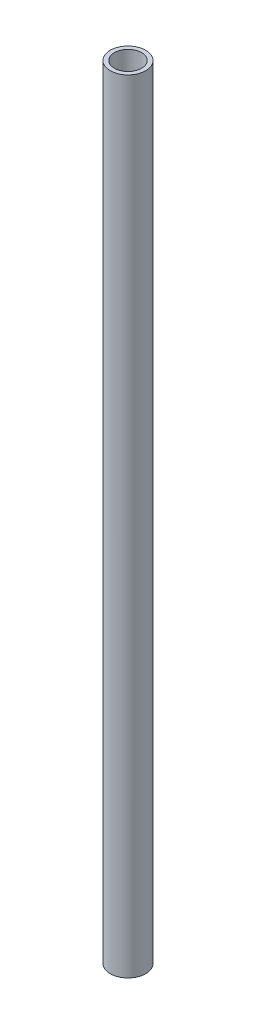
ISO-10303-21;
HEADER;
FILE_DESCRIPTION(('STEP AP214'),'2;1');
FILE_NAME('part.step','',(''),(''),'','','');
FILE_SCHEMA(('AUTOMOTIVE_DESIGN { 1 0 10303 214 1 1 1 1 }'));
ENDSEC;
DATA;
#1=APPLICATION_CONTEXT('core data for automotive mechanical design processes');
#2=APPLICATION_PROTOCOL_DEFINITION('international standard','automotive_design',2000,#1);
#3=PRODUCT_CONTEXT('',#1,'mechanical');
#4=PRODUCT('Part','Part','',(#3));
#5=PRODUCT_RELATED_PRODUCT_CATEGORY('part','',(#4));
#6=PRODUCT_DEFINITION_FORMATION('','',#4);
#7=PRODUCT_DEFINITION_CONTEXT('part definition',#1,'design');
#8=PRODUCT_DEFINITION('design','',#6,#7);
#9=PRODUCT_DEFINITION_SHAPE('','',#8);
#10=(LENGTH_UNIT() NAMED_UNIT(*) SI_UNIT(.MILLI.,.METRE.));
#11=(NAMED_UNIT(*) PLANE_ANGLE_UNIT() SI_UNIT($,.RADIAN.));
#12=(NAMED_UNIT(*) SI_UNIT($,.STERADIAN.) SOLID_ANGLE_UNIT());
#13=UNCERTAINTY_MEASURE_WITH_UNIT(LENGTH_MEASURE(1.E-05),#10,'distance_accuracy_value','');
#14=(GEOMETRIC_REPRESENTATION_CONTEXT(3) GLOBAL_UNCERTAINTY_ASSIGNED_CONTEXT((#13)) GLOBAL_UNIT_ASSIGNED_CONTEXT((#10,
#11,#12)) REPRESENTATION_CONTEXT('',''));
#15=CARTESIAN_POINT('',(0.,0.,0.));
#16=DIRECTION('',(0.,0.,1.));
#17=DIRECTION('',(1.,0.,0.));
#18=AXIS2_PLACEMENT_3D('',#15,#16,#17);
#19=CARTESIAN_POINT('',(0.,-140.085760537601,0.));
#20=DIRECTION('',(0.,1.,0.));
#21=DIRECTION('',(-1.,0.,0.));
#22=AXIS2_PLACEMENT_3D('',#19,#20,#21);
#23=PLANE('',#22);
#24=CARTESIAN_POINT('',(0.,-140.085760537601,0.));
#25=DIRECTION('',(0.,1.,0.));
#26=DIRECTION('',(-1.,0.,0.));
#27=AXIS2_PLACEMENT_3D('',#24,#25,#26);
#28=CIRCLE('',#27,6.35);
#29=CARTESIAN_POINT('',(-6.35,-140.085760537601,0.));
#30=VERTEX_POINT('',#29);
#31=EDGE_CURVE('E34',#30,#30,#28,.T.);
#32=ORIENTED_EDGE('',*,*,#31,.F.);
#33=EDGE_LOOP('',(#32));
#34=FACE_BOUND('',#33,.T.);
#35=CARTESIAN_POINT('',(0.,-140.085760537601,0.));
#36=DIRECTION('',(0.,1.,0.));
#37=DIRECTION('',(-1.,0.,0.));
#38=AXIS2_PLACEMENT_3D('',#35,#36,#37);
#39=CIRCLE('',#38,4.8768);
#40=CARTESIAN_POINT('',(-4.8768,-140.085760537601,0.));
#41=VERTEX_POINT('',#40);
#42=EDGE_CURVE('E44',#41,#41,#39,.T.);
#43=ORIENTED_EDGE('',*,*,#42,.T.);
#44=EDGE_LOOP('',(#43));
#45=FACE_BOUND('',#44,.T.);
#46=ADVANCED_FACE('F30',(#34,#45),#23,.F.);
#47=CARTESIAN_POINT('',(0.,158.046272779739,0.));
#48=DIRECTION('',(0.,-1.,0.));
#49=DIRECTION('',(0.,0.,-1.));
#50=AXIS2_PLACEMENT_3D('',#47,#48,#49);
#51=CYLINDRICAL_SURFACE('',#50,6.35);
#52=CARTESIAN_POINT('',(0.,140.085760537601,0.));
#53=DIRECTION('',(0.,-1.,0.));
#54=DIRECTION('',(-0.902430234251558,0.,0.430836015565875));
#55=AXIS2_PLACEMENT_3D('',#52,#53,#54);
#56=CIRCLE('',#55,6.35);
#57=CARTESIAN_POINT('',(-5.73043198749741,140.085760537601,2.73580869884327));
#58=VERTEX_POINT('',#57);
#59=EDGE_CURVE('E10',#58,#58,#56,.T.);
#60=ORIENTED_EDGE('',*,*,#59,.T.);
#61=EDGE_LOOP('',(#60));
#62=FACE_BOUND('',#61,.T.);
#63=ORIENTED_EDGE('',*,*,#31,.T.);
#64=EDGE_LOOP('',(#63));
#65=FACE_BOUND('',#64,.T.);
#66=ADVANCED_FACE('F32',(#62,#65),#51,.T.);
#67=CARTESIAN_POINT('',(0.,158.046272779739,0.));
#68=DIRECTION('',(0.,-1.,0.));
#69=DIRECTION('',(0.,0.,-1.));
#70=AXIS2_PLACEMENT_3D('',#67,#68,#69);
#71=CYLINDRICAL_SURFACE('',#70,4.8768);
#72=CARTESIAN_POINT('',(0.,140.085760537601,0.));
#73=DIRECTION('',(0.,-1.,0.));
#74=DIRECTION('',(-0.902430234251558,0.,0.430836015565875));
#75=AXIS2_PLACEMENT_3D('',#72,#73,#74);
#76=CIRCLE('',#75,4.8768);
#77=CARTESIAN_POINT('',(-4.40097176639801,140.085760537601,2.10110108071162));
#78=VERTEX_POINT('',#77);
#79=EDGE_CURVE('E38',#78,#78,#76,.T.);
#80=ORIENTED_EDGE('',*,*,#79,.F.);
#81=EDGE_LOOP('',(#80));
#82=FACE_BOUND('',#81,.T.);
#83=ORIENTED_EDGE('',*,*,#42,.F.);
#84=EDGE_LOOP('',(#83));
#85=FACE_BOUND('',#84,.T.);
#86=ADVANCED_FACE('F56',(#82,#85),#71,.F.);
#87=CARTESIAN_POINT('',(0.,140.085760537601,0.));
#88=DIRECTION('',(0.,-1.,0.));
#89=DIRECTION('',(-0.902430234251558,0.,0.430836015565875));
#90=AXIS2_PLACEMENT_3D('',#87,#88,#89);
#91=PLANE('',#90);
#92=ORIENTED_EDGE('',*,*,#79,.T.);
#93=EDGE_LOOP('',(#92));
#94=FACE_BOUND('',#93,.T.);
#95=ORIENTED_EDGE('',*,*,#59,.F.);
#96=EDGE_LOOP('',(#95));
#97=FACE_BOUND('',#96,.T.);
#98=ADVANCED_FACE('F60',(#94,#97),#91,.F.);
#99=CLOSED_SHELL('',(#46,#66,#86,#98));
#100=MANIFOLD_SOLID_BREP('B2',#99);
#101=ADVANCED_BREP_SHAPE_REPRESENTATION('',(#18,#100),#14);
#102=SHAPE_DEFINITION_REPRESENTATION(#9,#101);
ENDSEC;
END-ISO-10303-21;
